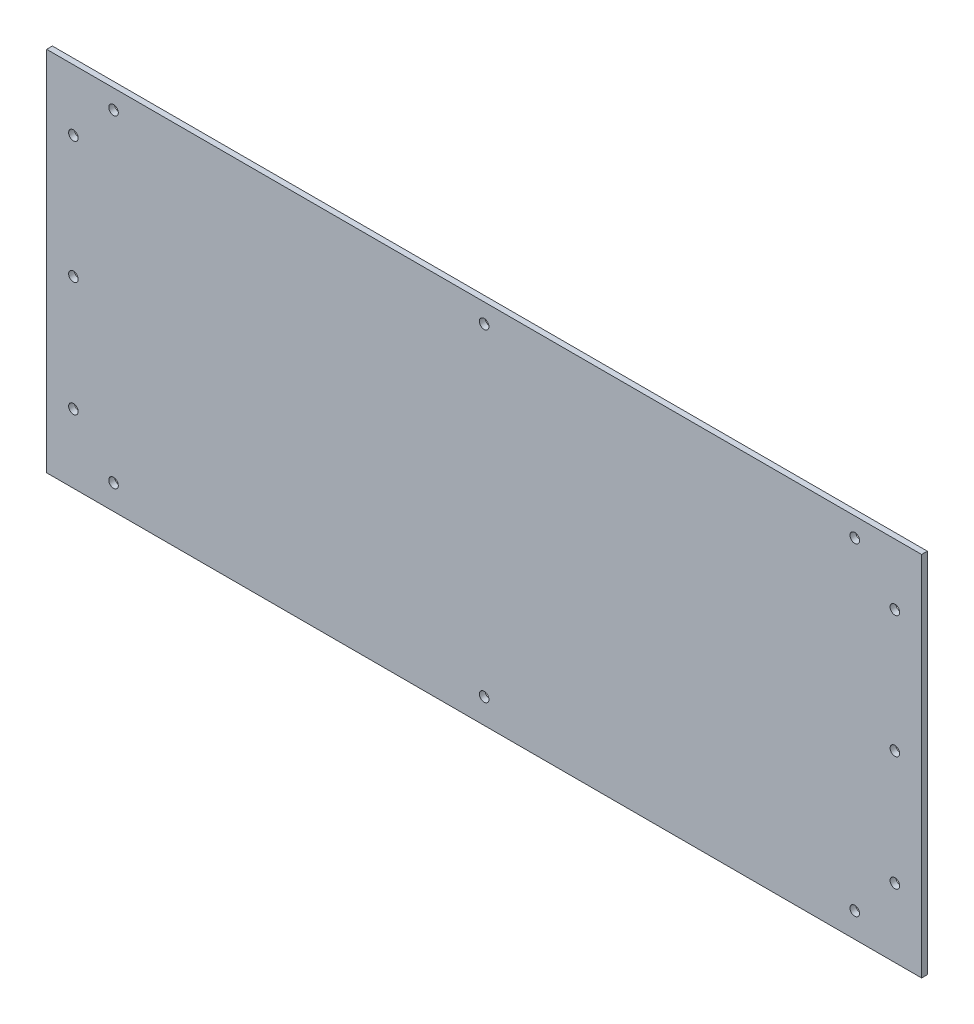
ISO-10303-21;
HEADER;
FILE_DESCRIPTION(('STEP AP214'),'2;1');
FILE_NAME('part.step','',(''),(''),'','','');
FILE_SCHEMA(('AUTOMOTIVE_DESIGN { 1 0 10303 214 1 1 1 1 }'));
ENDSEC;
DATA;
#1=APPLICATION_CONTEXT('core data for automotive mechanical design processes');
#2=APPLICATION_PROTOCOL_DEFINITION('international standard','automotive_design',2000,#1);
#3=PRODUCT_CONTEXT('',#1,'mechanical');
#4=PRODUCT('Part','Part','',(#3));
#5=PRODUCT_RELATED_PRODUCT_CATEGORY('part','',(#4));
#6=PRODUCT_DEFINITION_FORMATION('','',#4);
#7=PRODUCT_DEFINITION_CONTEXT('part definition',#1,'design');
#8=PRODUCT_DEFINITION('design','',#6,#7);
#9=PRODUCT_DEFINITION_SHAPE('','',#8);
#10=(LENGTH_UNIT() NAMED_UNIT(*) SI_UNIT(.MILLI.,.METRE.));
#11=(NAMED_UNIT(*) PLANE_ANGLE_UNIT() SI_UNIT($,.RADIAN.));
#12=(NAMED_UNIT(*) SI_UNIT($,.STERADIAN.) SOLID_ANGLE_UNIT());
#13=UNCERTAINTY_MEASURE_WITH_UNIT(LENGTH_MEASURE(1.E-05),#10,'distance_accuracy_value','');
#14=(GEOMETRIC_REPRESENTATION_CONTEXT(3) GLOBAL_UNCERTAINTY_ASSIGNED_CONTEXT((#13)) GLOBAL_UNIT_ASSIGNED_CONTEXT((#10,
#11,#12)) REPRESENTATION_CONTEXT('',''));
#15=CARTESIAN_POINT('',(0.,0.,0.));
#16=DIRECTION('',(0.,0.,1.));
#17=DIRECTION('',(1.,0.,0.));
#18=AXIS2_PLACEMENT_3D('',#15,#16,#17);
#19=CARTESIAN_POINT('',(229.,96.,3.));
#20=DIRECTION('',(-1.,0.,0.));
#21=DIRECTION('',(0.,-1.,0.));
#22=AXIS2_PLACEMENT_3D('',#19,#20,#21);
#23=PLANE('',#22);
#24=DIRECTION('',(0.,1.,0.));
#25=VECTOR('',#24,1.);
#26=CARTESIAN_POINT('',(229.,96.,0.));
#27=LINE('',#26,#25);
#28=CARTESIAN_POINT('',(229.,-96.,0.));
#29=VERTEX_POINT('',#28);
#30=CARTESIAN_POINT('',(229.,96.,0.));
#31=VERTEX_POINT('',#30);
#32=EDGE_CURVE('E112',#29,#31,#27,.T.);
#33=ORIENTED_EDGE('',*,*,#32,.T.);
#34=DIRECTION('',(0.,0.,-1.));
#35=VECTOR('',#34,1.);
#36=CARTESIAN_POINT('',(229.,96.,3.));
#37=LINE('',#36,#35);
#38=CARTESIAN_POINT('',(229.,96.,3.));
#39=VERTEX_POINT('',#38);
#40=EDGE_CURVE('E11',#39,#31,#37,.T.);
#41=ORIENTED_EDGE('',*,*,#40,.F.);
#42=DIRECTION('',(0.,1.,0.));
#43=VECTOR('',#42,1.);
#44=CARTESIAN_POINT('',(229.,96.,3.));
#45=LINE('',#44,#43);
#46=CARTESIAN_POINT('',(229.,-96.,3.));
#47=VERTEX_POINT('',#46);
#48=EDGE_CURVE('E96',#47,#39,#45,.T.);
#49=ORIENTED_EDGE('',*,*,#48,.F.);
#50=DIRECTION('',(0.,0.,-1.));
#51=VECTOR('',#50,1.);
#52=CARTESIAN_POINT('',(229.,-96.,3.));
#53=LINE('',#52,#51);
#54=EDGE_CURVE('E108',#47,#29,#53,.T.);
#55=ORIENTED_EDGE('',*,*,#54,.T.);
#56=EDGE_LOOP('',(#33,#41,#49,#55));
#57=FACE_BOUND('',#56,.T.);
#58=ADVANCED_FACE('F44',(#57),#23,.F.);
#59=CARTESIAN_POINT('',(-229.,96.,3.));
#60=DIRECTION('',(0.,-1.,0.));
#61=DIRECTION('',(0.,0.,-1.));
#62=AXIS2_PLACEMENT_3D('',#59,#60,#61);
#63=PLANE('',#62);
#64=DIRECTION('',(-1.,0.,0.));
#65=VECTOR('',#64,1.);
#66=CARTESIAN_POINT('',(-229.,96.,0.));
#67=LINE('',#66,#65);
#68=CARTESIAN_POINT('',(-229.,96.,0.));
#69=VERTEX_POINT('',#68);
#70=EDGE_CURVE('E101',#31,#69,#67,.T.);
#71=ORIENTED_EDGE('',*,*,#70,.T.);
#72=DIRECTION('',(0.,0.,-1.));
#73=VECTOR('',#72,1.);
#74=CARTESIAN_POINT('',(-229.,96.,3.));
#75=LINE('',#74,#73);
#76=CARTESIAN_POINT('',(-229.,96.,3.));
#77=VERTEX_POINT('',#76);
#78=EDGE_CURVE('E53',#77,#69,#75,.T.);
#79=ORIENTED_EDGE('',*,*,#78,.F.);
#80=DIRECTION('',(-1.,0.,0.));
#81=VECTOR('',#80,1.);
#82=CARTESIAN_POINT('',(-229.,96.,3.));
#83=LINE('',#82,#81);
#84=EDGE_CURVE('E91',#39,#77,#83,.T.);
#85=ORIENTED_EDGE('',*,*,#84,.F.);
#86=ORIENTED_EDGE('',*,*,#40,.T.);
#87=EDGE_LOOP('',(#71,#79,#85,#86));
#88=FACE_BOUND('',#87,.T.);
#89=ADVANCED_FACE('F100',(#88),#63,.F.);
#90=CARTESIAN_POINT('',(-229.,96.,3.));
#91=DIRECTION('',(1.,0.,0.));
#92=DIRECTION('',(0.,1.,0.));
#93=AXIS2_PLACEMENT_3D('',#90,#91,#92);
#94=PLANE('',#93);
#95=DIRECTION('',(0.,-1.,0.));
#96=VECTOR('',#95,1.);
#97=CARTESIAN_POINT('',(-229.,96.,0.));
#98=LINE('',#97,#96);
#99=CARTESIAN_POINT('',(-229.,-96.,0.));
#100=VERTEX_POINT('',#99);
#101=EDGE_CURVE('E78',#69,#100,#98,.T.);
#102=ORIENTED_EDGE('',*,*,#101,.T.);
#103=DIRECTION('',(0.,0.,-1.));
#104=VECTOR('',#103,1.);
#105=CARTESIAN_POINT('',(-229.,-96.,3.));
#106=LINE('',#105,#104);
#107=CARTESIAN_POINT('',(-229.,-96.,3.));
#108=VERTEX_POINT('',#107);
#109=EDGE_CURVE('E103',#108,#100,#106,.T.);
#110=ORIENTED_EDGE('',*,*,#109,.F.);
#111=DIRECTION('',(0.,-1.,0.));
#112=VECTOR('',#111,1.);
#113=CARTESIAN_POINT('',(-229.,96.,3.));
#114=LINE('',#113,#112);
#115=EDGE_CURVE('E94',#77,#108,#114,.T.);
#116=ORIENTED_EDGE('',*,*,#115,.F.);
#117=ORIENTED_EDGE('',*,*,#78,.T.);
#118=EDGE_LOOP('',(#102,#110,#116,#117));
#119=FACE_BOUND('',#118,.T.);
#120=ADVANCED_FACE('F104',(#119),#94,.F.);
#121=CARTESIAN_POINT('',(-229.,-96.,3.));
#122=DIRECTION('',(0.,1.,0.));
#123=DIRECTION('',(0.,0.,1.));
#124=AXIS2_PLACEMENT_3D('',#121,#122,#123);
#125=PLANE('',#124);
#126=DIRECTION('',(1.,0.,0.));
#127=VECTOR('',#126,1.);
#128=CARTESIAN_POINT('',(-229.,-96.,0.));
#129=LINE('',#128,#127);
#130=EDGE_CURVE('E84',#100,#29,#129,.T.);
#131=ORIENTED_EDGE('',*,*,#130,.T.);
#132=ORIENTED_EDGE('',*,*,#54,.F.);
#133=DIRECTION('',(1.,0.,0.));
#134=VECTOR('',#133,1.);
#135=CARTESIAN_POINT('',(-229.,-96.,3.));
#136=LINE('',#135,#134);
#137=EDGE_CURVE('E61',#108,#47,#136,.T.);
#138=ORIENTED_EDGE('',*,*,#137,.F.);
#139=ORIENTED_EDGE('',*,*,#109,.T.);
#140=EDGE_LOOP('',(#131,#132,#138,#139));
#141=FACE_BOUND('',#140,.T.);
#142=ADVANCED_FACE('F126',(#141),#125,.F.);
#143=CARTESIAN_POINT('',(0.,0.,3.));
#144=DIRECTION('',(0.,0.,1.));
#145=DIRECTION('',(1.,0.,0.));
#146=AXIS2_PLACEMENT_3D('',#143,#144,#145);
#147=PLANE('',#146);
#148=CARTESIAN_POINT('',(215.,-59.9999999999999,3.));
#149=DIRECTION('',(0.,0.,1.));
#150=DIRECTION('',(1.,0.,0.));
#151=AXIS2_PLACEMENT_3D('',#148,#149,#150);
#152=CIRCLE('',#151,2.49999999999991);
#153=CARTESIAN_POINT('',(217.5,-59.9999999999999,3.));
#154=VERTEX_POINT('',#153);
#155=EDGE_CURVE('E177',#154,#154,#152,.T.);
#156=ORIENTED_EDGE('',*,*,#155,.F.);
#157=EDGE_LOOP('',(#156));
#158=FACE_BOUND('',#157,.T.);
#159=CARTESIAN_POINT('',(215.,1.11022302462516E-13,3.));
#160=DIRECTION('',(0.,0.,1.));
#161=DIRECTION('',(1.,0.,0.));
#162=AXIS2_PLACEMENT_3D('',#159,#160,#161);
#163=CIRCLE('',#162,2.49999999999991);
#164=CARTESIAN_POINT('',(217.5,1.11022302462516E-13,3.));
#165=VERTEX_POINT('',#164);
#166=EDGE_CURVE('E186',#165,#165,#163,.T.);
#167=ORIENTED_EDGE('',*,*,#166,.F.);
#168=EDGE_LOOP('',(#167));
#169=FACE_BOUND('',#168,.T.);
#170=CARTESIAN_POINT('',(-215.,64.,3.));
#171=DIRECTION('',(0.,0.,1.));
#172=DIRECTION('',(1.,0.,0.));
#173=AXIS2_PLACEMENT_3D('',#170,#171,#172);
#174=CIRCLE('',#173,2.50000000000013);
#175=CARTESIAN_POINT('',(-212.5,64.,3.));
#176=VERTEX_POINT('',#175);
#177=EDGE_CURVE('E194',#176,#176,#174,.T.);
#178=ORIENTED_EDGE('',*,*,#177,.F.);
#179=EDGE_LOOP('',(#178));
#180=FACE_BOUND('',#179,.T.);
#181=CARTESIAN_POINT('',(-215.,-60.,3.));
#182=DIRECTION('',(0.,0.,1.));
#183=DIRECTION('',(1.,0.,0.));
#184=AXIS2_PLACEMENT_3D('',#181,#182,#183);
#185=CIRCLE('',#184,2.50000000000014);
#186=CARTESIAN_POINT('',(-212.5,-60.,3.));
#187=VERTEX_POINT('',#186);
#188=EDGE_CURVE('E146',#187,#187,#185,.T.);
#189=ORIENTED_EDGE('',*,*,#188,.F.);
#190=EDGE_LOOP('',(#189));
#191=FACE_BOUND('',#190,.T.);
#192=CARTESIAN_POINT('',(-215.,0.,3.));
#193=DIRECTION('',(0.,0.,1.));
#194=DIRECTION('',(1.,0.,0.));
#195=AXIS2_PLACEMENT_3D('',#192,#193,#194);
#196=CIRCLE('',#195,2.50000000000014);
#197=CARTESIAN_POINT('',(-212.5,0.,3.));
#198=VERTEX_POINT('',#197);
#199=EDGE_CURVE('E145',#198,#198,#196,.T.);
#200=ORIENTED_EDGE('',*,*,#199,.F.);
#201=EDGE_LOOP('',(#200));
#202=FACE_BOUND('',#201,.T.);
#203=CARTESIAN_POINT('',(194.,86.,3.));
#204=DIRECTION('',(0.,0.,1.));
#205=DIRECTION('',(1.,0.,0.));
#206=AXIS2_PLACEMENT_3D('',#203,#204,#205);
#207=CIRCLE('',#206,2.50000000000037);
#208=CARTESIAN_POINT('',(196.5,86.,3.));
#209=VERTEX_POINT('',#208);
#210=EDGE_CURVE('E154',#209,#209,#207,.T.);
#211=ORIENTED_EDGE('',*,*,#210,.F.);
#212=EDGE_LOOP('',(#211));
#213=FACE_BOUND('',#212,.T.);
#214=CARTESIAN_POINT('',(194.,-83.0045925405617,3.));
#215=DIRECTION('',(0.,0.,1.));
#216=DIRECTION('',(1.,0.,0.));
#217=AXIS2_PLACEMENT_3D('',#214,#215,#216);
#218=CIRCLE('',#217,2.50000000000014);
#219=CARTESIAN_POINT('',(196.5,-83.0045925405617,3.));
#220=VERTEX_POINT('',#219);
#221=EDGE_CURVE('E162',#220,#220,#218,.T.);
#222=ORIENTED_EDGE('',*,*,#221,.F.);
#223=EDGE_LOOP('',(#222));
#224=FACE_BOUND('',#223,.T.);
#225=CARTESIAN_POINT('',(-194.,-83.0045925405617,3.));
#226=DIRECTION('',(0.,0.,1.));
#227=DIRECTION('',(1.,0.,0.));
#228=AXIS2_PLACEMENT_3D('',#225,#226,#227);
#229=CIRCLE('',#228,2.50000000000014);
#230=CARTESIAN_POINT('',(-191.5,-83.0045925405617,3.));
#231=VERTEX_POINT('',#230);
#232=EDGE_CURVE('E137',#231,#231,#229,.T.);
#233=ORIENTED_EDGE('',*,*,#232,.F.);
#234=EDGE_LOOP('',(#233));
#235=FACE_BOUND('',#234,.T.);
#236=CARTESIAN_POINT('',(215.,64.0000000000001,3.));
#237=DIRECTION('',(0.,0.,1.));
#238=DIRECTION('',(1.,0.,0.));
#239=AXIS2_PLACEMENT_3D('',#236,#237,#238);
#240=CIRCLE('',#239,2.49999999999992);
#241=CARTESIAN_POINT('',(217.5,64.0000000000001,3.));
#242=VERTEX_POINT('',#241);
#243=EDGE_CURVE('E178',#242,#242,#240,.T.);
#244=ORIENTED_EDGE('',*,*,#243,.F.);
#245=EDGE_LOOP('',(#244));
#246=FACE_BOUND('',#245,.T.);
#247=CARTESIAN_POINT('',(-1.11022302462516E-13,86.,3.));
#248=DIRECTION('',(0.,0.,1.));
#249=DIRECTION('',(1.,0.,0.));
#250=AXIS2_PLACEMENT_3D('',#247,#248,#249);
#251=CIRCLE('',#250,2.49999999999992);
#252=CARTESIAN_POINT('',(2.49999999999981,86.,3.));
#253=VERTEX_POINT('',#252);
#254=EDGE_CURVE('E217',#253,#253,#251,.T.);
#255=ORIENTED_EDGE('',*,*,#254,.F.);
#256=EDGE_LOOP('',(#255));
#257=FACE_BOUND('',#256,.T.);
#258=CARTESIAN_POINT('',(0.,-83.,3.));
#259=DIRECTION('',(0.,0.,1.));
#260=DIRECTION('',(1.,0.,0.));
#261=AXIS2_PLACEMENT_3D('',#258,#259,#260);
#262=CIRCLE('',#261,2.49999999999992);
#263=CARTESIAN_POINT('',(2.49999999999992,-83.,3.));
#264=VERTEX_POINT('',#263);
#265=EDGE_CURVE('E209',#264,#264,#262,.T.);
#266=ORIENTED_EDGE('',*,*,#265,.F.);
#267=EDGE_LOOP('',(#266));
#268=FACE_BOUND('',#267,.T.);
#269=CARTESIAN_POINT('',(-194.,86.,3.));
#270=DIRECTION('',(0.,0.,1.));
#271=DIRECTION('',(1.,0.,0.));
#272=AXIS2_PLACEMENT_3D('',#269,#270,#271);
#273=CIRCLE('',#272,2.50000000000013);
#274=CARTESIAN_POINT('',(-191.5,86.,3.));
#275=VERTEX_POINT('',#274);
#276=EDGE_CURVE('E133',#275,#275,#273,.T.);
#277=ORIENTED_EDGE('',*,*,#276,.F.);
#278=EDGE_LOOP('',(#277));
#279=FACE_BOUND('',#278,.T.);
#280=ORIENTED_EDGE('',*,*,#48,.T.);
#281=ORIENTED_EDGE('',*,*,#84,.T.);
#282=ORIENTED_EDGE('',*,*,#115,.T.);
#283=ORIENTED_EDGE('',*,*,#137,.T.);
#284=EDGE_LOOP('',(#280,#281,#282,#283));
#285=FACE_BOUND('',#284,.T.);
#286=ADVANCED_FACE('F92',(#158,#169,#180,#191,#202,#213,#224,#235,#246,#257,#268,#279,#285),
#147,.T.);
#287=CARTESIAN_POINT('',(0.,0.,0.));
#288=DIRECTION('',(0.,0.,1.));
#289=DIRECTION('',(1.,0.,0.));
#290=AXIS2_PLACEMENT_3D('',#287,#288,#289);
#291=PLANE('',#290);
#292=CARTESIAN_POINT('',(215.,-59.9999999999999,0.));
#293=DIRECTION('',(0.,0.,1.));
#294=DIRECTION('',(1.,0.,0.));
#295=AXIS2_PLACEMENT_3D('',#292,#293,#294);
#296=CIRCLE('',#295,2.49999999999991);
#297=CARTESIAN_POINT('',(217.5,-59.9999999999999,0.));
#298=VERTEX_POINT('',#297);
#299=EDGE_CURVE('E173',#298,#298,#296,.T.);
#300=ORIENTED_EDGE('',*,*,#299,.T.);
#301=EDGE_LOOP('',(#300));
#302=FACE_BOUND('',#301,.T.);
#303=CARTESIAN_POINT('',(215.,1.11022302462516E-13,0.));
#304=DIRECTION('',(0.,0.,1.));
#305=DIRECTION('',(1.,0.,0.));
#306=AXIS2_PLACEMENT_3D('',#303,#304,#305);
#307=CIRCLE('',#306,2.49999999999991);
#308=CARTESIAN_POINT('',(217.5,1.11022302462516E-13,0.));
#309=VERTEX_POINT('',#308);
#310=EDGE_CURVE('E182',#309,#309,#307,.T.);
#311=ORIENTED_EDGE('',*,*,#310,.T.);
#312=EDGE_LOOP('',(#311));
#313=FACE_BOUND('',#312,.T.);
#314=CARTESIAN_POINT('',(-215.,64.,0.));
#315=DIRECTION('',(0.,0.,1.));
#316=DIRECTION('',(1.,0.,0.));
#317=AXIS2_PLACEMENT_3D('',#314,#315,#316);
#318=CIRCLE('',#317,2.50000000000013);
#319=CARTESIAN_POINT('',(-212.5,64.,0.));
#320=VERTEX_POINT('',#319);
#321=EDGE_CURVE('E190',#320,#320,#318,.T.);
#322=ORIENTED_EDGE('',*,*,#321,.T.);
#323=EDGE_LOOP('',(#322));
#324=FACE_BOUND('',#323,.T.);
#325=CARTESIAN_POINT('',(-215.,-60.,0.));
#326=DIRECTION('',(0.,0.,1.));
#327=DIRECTION('',(1.,0.,0.));
#328=AXIS2_PLACEMENT_3D('',#325,#326,#327);
#329=CIRCLE('',#328,2.50000000000014);
#330=CARTESIAN_POINT('',(-212.5,-60.,0.));
#331=VERTEX_POINT('',#330);
#332=EDGE_CURVE('E198',#331,#331,#329,.T.);
#333=ORIENTED_EDGE('',*,*,#332,.T.);
#334=EDGE_LOOP('',(#333));
#335=FACE_BOUND('',#334,.T.);
#336=CARTESIAN_POINT('',(-215.,0.,0.));
#337=DIRECTION('',(0.,0.,1.));
#338=DIRECTION('',(1.,0.,0.));
#339=AXIS2_PLACEMENT_3D('',#336,#337,#338);
#340=CIRCLE('',#339,2.50000000000014);
#341=CARTESIAN_POINT('',(-212.5,0.,0.));
#342=VERTEX_POINT('',#341);
#343=EDGE_CURVE('E141',#342,#342,#340,.T.);
#344=ORIENTED_EDGE('',*,*,#343,.T.);
#345=EDGE_LOOP('',(#344));
#346=FACE_BOUND('',#345,.T.);
#347=CARTESIAN_POINT('',(194.,86.,0.));
#348=DIRECTION('',(0.,0.,1.));
#349=DIRECTION('',(1.,0.,0.));
#350=AXIS2_PLACEMENT_3D('',#347,#348,#349);
#351=CIRCLE('',#350,2.50000000000037);
#352=CARTESIAN_POINT('',(196.5,86.,0.));
#353=VERTEX_POINT('',#352);
#354=EDGE_CURVE('E150',#353,#353,#351,.T.);
#355=ORIENTED_EDGE('',*,*,#354,.T.);
#356=EDGE_LOOP('',(#355));
#357=FACE_BOUND('',#356,.T.);
#358=CARTESIAN_POINT('',(194.,-83.0045925405617,0.));
#359=DIRECTION('',(0.,0.,1.));
#360=DIRECTION('',(1.,0.,0.));
#361=AXIS2_PLACEMENT_3D('',#358,#359,#360);
#362=CIRCLE('',#361,2.50000000000014);
#363=CARTESIAN_POINT('',(196.5,-83.0045925405617,0.));
#364=VERTEX_POINT('',#363);
#365=EDGE_CURVE('E158',#364,#364,#362,.T.);
#366=ORIENTED_EDGE('',*,*,#365,.T.);
#367=EDGE_LOOP('',(#366));
#368=FACE_BOUND('',#367,.T.);
#369=CARTESIAN_POINT('',(-194.,-83.0045925405617,0.));
#370=DIRECTION('',(0.,0.,1.));
#371=DIRECTION('',(1.,0.,0.));
#372=AXIS2_PLACEMENT_3D('',#369,#370,#371);
#373=CIRCLE('',#372,2.50000000000014);
#374=CARTESIAN_POINT('',(-191.5,-83.0045925405617,0.));
#375=VERTEX_POINT('',#374);
#376=EDGE_CURVE('E166',#375,#375,#373,.T.);
#377=ORIENTED_EDGE('',*,*,#376,.T.);
#378=EDGE_LOOP('',(#377));
#379=FACE_BOUND('',#378,.T.);
#380=CARTESIAN_POINT('',(215.,64.0000000000001,0.));
#381=DIRECTION('',(0.,0.,1.));
#382=DIRECTION('',(1.,0.,0.));
#383=AXIS2_PLACEMENT_3D('',#380,#381,#382);
#384=CIRCLE('',#383,2.49999999999992);
#385=CARTESIAN_POINT('',(217.5,64.0000000000001,0.));
#386=VERTEX_POINT('',#385);
#387=EDGE_CURVE('E221',#386,#386,#384,.T.);
#388=ORIENTED_EDGE('',*,*,#387,.T.);
#389=EDGE_LOOP('',(#388));
#390=FACE_BOUND('',#389,.T.);
#391=CARTESIAN_POINT('',(-1.11022302462516E-13,86.,0.));
#392=DIRECTION('',(0.,0.,1.));
#393=DIRECTION('',(1.,0.,0.));
#394=AXIS2_PLACEMENT_3D('',#391,#392,#393);
#395=CIRCLE('',#394,2.49999999999992);
#396=CARTESIAN_POINT('',(2.49999999999981,86.,0.));
#397=VERTEX_POINT('',#396);
#398=EDGE_CURVE('E213',#397,#397,#395,.T.);
#399=ORIENTED_EDGE('',*,*,#398,.T.);
#400=EDGE_LOOP('',(#399));
#401=FACE_BOUND('',#400,.T.);
#402=CARTESIAN_POINT('',(0.,-83.,0.));
#403=DIRECTION('',(0.,0.,1.));
#404=DIRECTION('',(1.,0.,0.));
#405=AXIS2_PLACEMENT_3D('',#402,#403,#404);
#406=CIRCLE('',#405,2.49999999999992);
#407=CARTESIAN_POINT('',(2.49999999999992,-83.,0.));
#408=VERTEX_POINT('',#407);
#409=EDGE_CURVE('E205',#408,#408,#406,.T.);
#410=ORIENTED_EDGE('',*,*,#409,.T.);
#411=EDGE_LOOP('',(#410));
#412=FACE_BOUND('',#411,.T.);
#413=CARTESIAN_POINT('',(-194.,86.,0.));
#414=DIRECTION('',(0.,0.,1.));
#415=DIRECTION('',(1.,0.,0.));
#416=AXIS2_PLACEMENT_3D('',#413,#414,#415);
#417=CIRCLE('',#416,2.50000000000013);
#418=CARTESIAN_POINT('',(-191.5,86.,0.));
#419=VERTEX_POINT('',#418);
#420=EDGE_CURVE('E116',#419,#419,#417,.T.);
#421=ORIENTED_EDGE('',*,*,#420,.T.);
#422=EDGE_LOOP('',(#421));
#423=FACE_BOUND('',#422,.T.);
#424=ORIENTED_EDGE('',*,*,#32,.F.);
#425=ORIENTED_EDGE('',*,*,#130,.F.);
#426=ORIENTED_EDGE('',*,*,#101,.F.);
#427=ORIENTED_EDGE('',*,*,#70,.F.);
#428=EDGE_LOOP('',(#424,#425,#426,#427));
#429=FACE_BOUND('',#428,.T.);
#430=ADVANCED_FACE('F129',(#302,#313,#324,#335,#346,#357,#368,#379,#390,#401,#412,#423,#429),
#291,.F.);
#431=CARTESIAN_POINT('',(-194.,86.,0.));
#432=DIRECTION('',(0.,0.,1.));
#433=DIRECTION('',(1.,0.,0.));
#434=AXIS2_PLACEMENT_3D('',#431,#432,#433);
#435=CYLINDRICAL_SURFACE('',#434,2.50000000000013);
#436=ORIENTED_EDGE('',*,*,#420,.F.);
#437=EDGE_LOOP('',(#436));
#438=FACE_BOUND('',#437,.T.);
#439=ORIENTED_EDGE('',*,*,#276,.T.);
#440=EDGE_LOOP('',(#439));
#441=FACE_BOUND('',#440,.T.);
#442=ADVANCED_FACE('F241',(#438,#441),#435,.F.);
#443=CARTESIAN_POINT('',(0.,-83.,0.));
#444=DIRECTION('',(0.,0.,1.));
#445=DIRECTION('',(1.,0.,0.));
#446=AXIS2_PLACEMENT_3D('',#443,#444,#445);
#447=CYLINDRICAL_SURFACE('',#446,2.49999999999992);
#448=ORIENTED_EDGE('',*,*,#409,.F.);
#449=EDGE_LOOP('',(#448));
#450=FACE_BOUND('',#449,.T.);
#451=ORIENTED_EDGE('',*,*,#265,.T.);
#452=EDGE_LOOP('',(#451));
#453=FACE_BOUND('',#452,.T.);
#454=ADVANCED_FACE('F243',(#450,#453),#447,.F.);
#455=CARTESIAN_POINT('',(-1.11022302462516E-13,86.,0.));
#456=DIRECTION('',(0.,0.,1.));
#457=DIRECTION('',(1.,0.,0.));
#458=AXIS2_PLACEMENT_3D('',#455,#456,#457);
#459=CYLINDRICAL_SURFACE('',#458,2.49999999999992);
#460=ORIENTED_EDGE('',*,*,#398,.F.);
#461=EDGE_LOOP('',(#460));
#462=FACE_BOUND('',#461,.T.);
#463=ORIENTED_EDGE('',*,*,#254,.T.);
#464=EDGE_LOOP('',(#463));
#465=FACE_BOUND('',#464,.T.);
#466=ADVANCED_FACE('F250',(#462,#465),#459,.F.);
#467=CARTESIAN_POINT('',(215.,64.0000000000001,0.));
#468=DIRECTION('',(0.,0.,1.));
#469=DIRECTION('',(1.,0.,0.));
#470=AXIS2_PLACEMENT_3D('',#467,#468,#469);
#471=CYLINDRICAL_SURFACE('',#470,2.49999999999992);
#472=ORIENTED_EDGE('',*,*,#387,.F.);
#473=EDGE_LOOP('',(#472));
#474=FACE_BOUND('',#473,.T.);
#475=ORIENTED_EDGE('',*,*,#243,.T.);
#476=EDGE_LOOP('',(#475));
#477=FACE_BOUND('',#476,.T.);
#478=ADVANCED_FACE('F229',(#474,#477),#471,.F.);
#479=CARTESIAN_POINT('',(-194.,-83.0045925405617,0.));
#480=DIRECTION('',(0.,0.,1.));
#481=DIRECTION('',(1.,0.,0.));
#482=AXIS2_PLACEMENT_3D('',#479,#480,#481);
#483=CYLINDRICAL_SURFACE('',#482,2.50000000000014);
#484=ORIENTED_EDGE('',*,*,#376,.F.);
#485=EDGE_LOOP('',(#484));
#486=FACE_BOUND('',#485,.T.);
#487=ORIENTED_EDGE('',*,*,#232,.T.);
#488=EDGE_LOOP('',(#487));
#489=FACE_BOUND('',#488,.T.);
#490=ADVANCED_FACE('F311',(#486,#489),#483,.F.);
#491=CARTESIAN_POINT('',(194.,-83.0045925405617,0.));
#492=DIRECTION('',(0.,0.,1.));
#493=DIRECTION('',(1.,0.,0.));
#494=AXIS2_PLACEMENT_3D('',#491,#492,#493);
#495=CYLINDRICAL_SURFACE('',#494,2.50000000000014);
#496=ORIENTED_EDGE('',*,*,#365,.F.);
#497=EDGE_LOOP('',(#496));
#498=FACE_BOUND('',#497,.T.);
#499=ORIENTED_EDGE('',*,*,#221,.T.);
#500=EDGE_LOOP('',(#499));
#501=FACE_BOUND('',#500,.T.);
#502=ADVANCED_FACE('F322',(#498,#501),#495,.F.);
#503=CARTESIAN_POINT('',(194.,86.,0.));
#504=DIRECTION('',(0.,0.,1.));
#505=DIRECTION('',(1.,0.,0.));
#506=AXIS2_PLACEMENT_3D('',#503,#504,#505);
#507=CYLINDRICAL_SURFACE('',#506,2.50000000000037);
#508=ORIENTED_EDGE('',*,*,#354,.F.);
#509=EDGE_LOOP('',(#508));
#510=FACE_BOUND('',#509,.T.);
#511=ORIENTED_EDGE('',*,*,#210,.T.);
#512=EDGE_LOOP('',(#511));
#513=FACE_BOUND('',#512,.T.);
#514=ADVANCED_FACE('F333',(#510,#513),#507,.F.);
#515=CARTESIAN_POINT('',(-215.,0.,0.));
#516=DIRECTION('',(0.,0.,1.));
#517=DIRECTION('',(1.,0.,0.));
#518=AXIS2_PLACEMENT_3D('',#515,#516,#517);
#519=CYLINDRICAL_SURFACE('',#518,2.50000000000014);
#520=ORIENTED_EDGE('',*,*,#343,.F.);
#521=EDGE_LOOP('',(#520));
#522=FACE_BOUND('',#521,.T.);
#523=ORIENTED_EDGE('',*,*,#199,.T.);
#524=EDGE_LOOP('',(#523));
#525=FACE_BOUND('',#524,.T.);
#526=ADVANCED_FACE('F344',(#522,#525),#519,.F.);
#527=CARTESIAN_POINT('',(-215.,-60.,0.));
#528=DIRECTION('',(0.,0.,1.));
#529=DIRECTION('',(1.,0.,0.));
#530=AXIS2_PLACEMENT_3D('',#527,#528,#529);
#531=CYLINDRICAL_SURFACE('',#530,2.50000000000014);
#532=ORIENTED_EDGE('',*,*,#332,.F.);
#533=EDGE_LOOP('',(#532));
#534=FACE_BOUND('',#533,.T.);
#535=ORIENTED_EDGE('',*,*,#188,.T.);
#536=EDGE_LOOP('',(#535));
#537=FACE_BOUND('',#536,.T.);
#538=ADVANCED_FACE('F355',(#534,#537),#531,.F.);
#539=CARTESIAN_POINT('',(-215.,64.,0.));
#540=DIRECTION('',(0.,0.,1.));
#541=DIRECTION('',(1.,0.,0.));
#542=AXIS2_PLACEMENT_3D('',#539,#540,#541);
#543=CYLINDRICAL_SURFACE('',#542,2.50000000000013);
#544=ORIENTED_EDGE('',*,*,#321,.F.);
#545=EDGE_LOOP('',(#544));
#546=FACE_BOUND('',#545,.T.);
#547=ORIENTED_EDGE('',*,*,#177,.T.);
#548=EDGE_LOOP('',(#547));
#549=FACE_BOUND('',#548,.T.);
#550=ADVANCED_FACE('F365',(#546,#549),#543,.F.);
#551=CARTESIAN_POINT('',(215.,1.11022302462516E-13,0.));
#552=DIRECTION('',(0.,0.,1.));
#553=DIRECTION('',(1.,0.,0.));
#554=AXIS2_PLACEMENT_3D('',#551,#552,#553);
#555=CYLINDRICAL_SURFACE('',#554,2.49999999999991);
#556=ORIENTED_EDGE('',*,*,#310,.F.);
#557=EDGE_LOOP('',(#556));
#558=FACE_BOUND('',#557,.T.);
#559=ORIENTED_EDGE('',*,*,#166,.T.);
#560=EDGE_LOOP('',(#559));
#561=FACE_BOUND('',#560,.T.);
#562=ADVANCED_FACE('F376',(#558,#561),#555,.F.);
#563=CARTESIAN_POINT('',(215.,-59.9999999999999,0.));
#564=DIRECTION('',(0.,0.,1.));
#565=DIRECTION('',(1.,0.,0.));
#566=AXIS2_PLACEMENT_3D('',#563,#564,#565);
#567=CYLINDRICAL_SURFACE('',#566,2.49999999999991);
#568=ORIENTED_EDGE('',*,*,#299,.F.);
#569=EDGE_LOOP('',(#568));
#570=FACE_BOUND('',#569,.T.);
#571=ORIENTED_EDGE('',*,*,#155,.T.);
#572=EDGE_LOOP('',(#571));
#573=FACE_BOUND('',#572,.T.);
#574=ADVANCED_FACE('F387',(#570,#573),#567,.F.);
#575=CLOSED_SHELL('',(#58,#89,#120,#142,#286,#430,#442,#454,#466,#478,#490,#502,#514,#526,#538,
#550,#562,#574));
#576=MANIFOLD_SOLID_BREP('B2',#575);
#577=ADVANCED_BREP_SHAPE_REPRESENTATION('',(#18,#576),#14);
#578=SHAPE_DEFINITION_REPRESENTATION(#9,#577);
ENDSEC;
END-ISO-10303-21;
